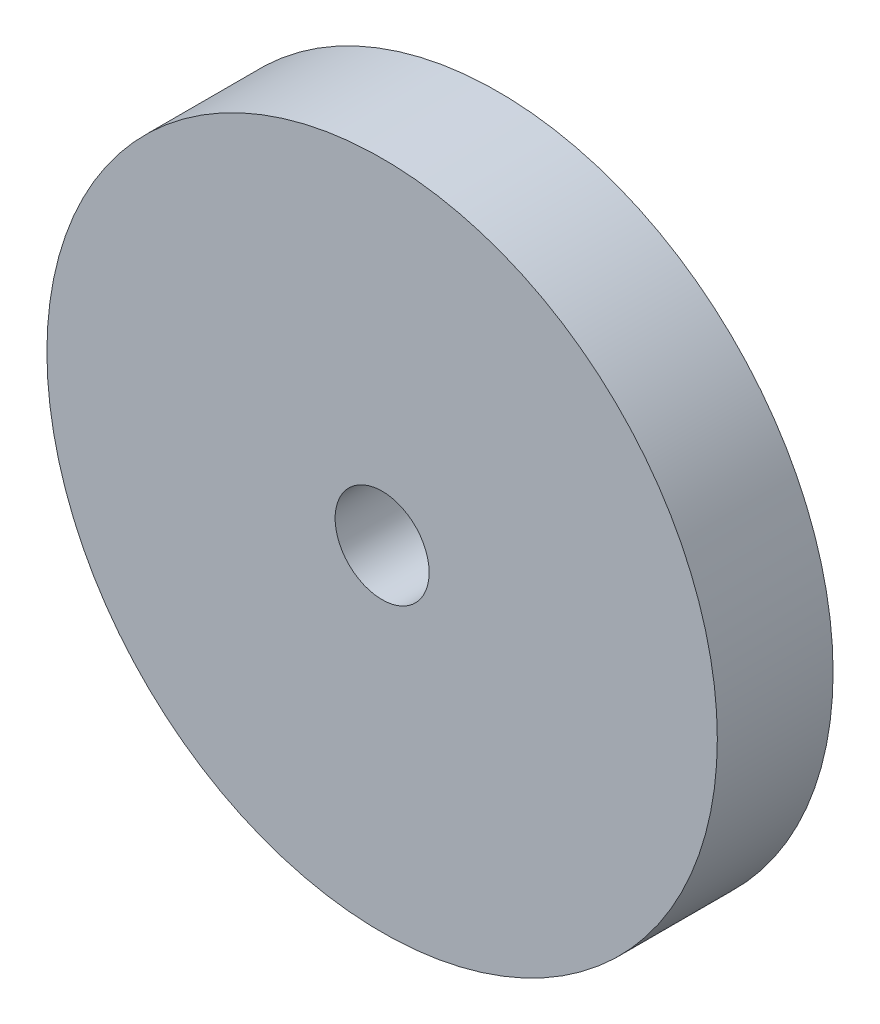
ISO-10303-21;
HEADER;
FILE_DESCRIPTION(('STEP AP214'),'2;1');
FILE_NAME('part.step','',(''),(''),'','','');
FILE_SCHEMA(('AUTOMOTIVE_DESIGN { 1 0 10303 214 1 1 1 1 }'));
ENDSEC;
DATA;
#1=APPLICATION_CONTEXT('core data for automotive mechanical design processes');
#2=APPLICATION_PROTOCOL_DEFINITION('international standard','automotive_design',2000,#1);
#3=PRODUCT_CONTEXT('',#1,'mechanical');
#4=PRODUCT('Part','Part','',(#3));
#5=PRODUCT_RELATED_PRODUCT_CATEGORY('part','',(#4));
#6=PRODUCT_DEFINITION_FORMATION('','',#4);
#7=PRODUCT_DEFINITION_CONTEXT('part definition',#1,'design');
#8=PRODUCT_DEFINITION('design','',#6,#7);
#9=PRODUCT_DEFINITION_SHAPE('','',#8);
#10=(LENGTH_UNIT() NAMED_UNIT(*) SI_UNIT(.MILLI.,.METRE.));
#11=(NAMED_UNIT(*) PLANE_ANGLE_UNIT() SI_UNIT($,.RADIAN.));
#12=(NAMED_UNIT(*) SI_UNIT($,.STERADIAN.) SOLID_ANGLE_UNIT());
#13=UNCERTAINTY_MEASURE_WITH_UNIT(LENGTH_MEASURE(1.E-05),#10,'distance_accuracy_value','');
#14=(GEOMETRIC_REPRESENTATION_CONTEXT(3) GLOBAL_UNCERTAINTY_ASSIGNED_CONTEXT((#13)) GLOBAL_UNIT_ASSIGNED_CONTEXT((#10,
#11,#12)) REPRESENTATION_CONTEXT('',''));
#15=CARTESIAN_POINT('',(0.,0.,0.));
#16=DIRECTION('',(0.,0.,1.));
#17=DIRECTION('',(1.,0.,0.));
#18=AXIS2_PLACEMENT_3D('',#15,#16,#17);
#19=CARTESIAN_POINT('',(0.,0.,6.));
#20=DIRECTION('',(0.,0.,1.));
#21=DIRECTION('',(1.,0.,0.));
#22=AXIS2_PLACEMENT_3D('',#19,#20,#21);
#23=PLANE('',#22);
#24=CARTESIAN_POINT('',(0.,0.,6.));
#25=DIRECTION('',(0.,0.,1.));
#26=DIRECTION('',(1.,0.,0.));
#27=AXIS2_PLACEMENT_3D('',#24,#25,#26);
#28=CIRCLE('',#27,17.3736);
#29=CARTESIAN_POINT('',(17.3736,0.,6.));
#30=VERTEX_POINT('',#29);
#31=EDGE_CURVE('E10',#30,#30,#28,.T.);
#32=ORIENTED_EDGE('',*,*,#31,.T.);
#33=EDGE_LOOP('',(#32));
#34=FACE_BOUND('',#33,.T.);
#35=CARTESIAN_POINT('',(0.,0.,6.));
#36=DIRECTION('',(0.,0.,1.));
#37=DIRECTION('',(1.,0.,0.));
#38=AXIS2_PLACEMENT_3D('',#35,#36,#37);
#39=CIRCLE('',#38,2.4365);
#40=CARTESIAN_POINT('',(2.4365,0.,6.));
#41=VERTEX_POINT('',#40);
#42=EDGE_CURVE('E42',#41,#41,#39,.T.);
#43=ORIENTED_EDGE('',*,*,#42,.F.);
#44=EDGE_LOOP('',(#43));
#45=FACE_BOUND('',#44,.T.);
#46=ADVANCED_FACE('F31',(#34,#45),#23,.T.);
#47=CARTESIAN_POINT('',(0.,0.,0.));
#48=DIRECTION('',(0.,0.,1.));
#49=DIRECTION('',(1.,0.,0.));
#50=AXIS2_PLACEMENT_3D('',#47,#48,#49);
#51=PLANE('',#50);
#52=CARTESIAN_POINT('',(0.,0.,0.));
#53=DIRECTION('',(0.,0.,1.));
#54=DIRECTION('',(1.,0.,0.));
#55=AXIS2_PLACEMENT_3D('',#52,#53,#54);
#56=CIRCLE('',#55,17.3736);
#57=CARTESIAN_POINT('',(17.3736,0.,0.));
#58=VERTEX_POINT('',#57);
#59=EDGE_CURVE('E35',#58,#58,#56,.T.);
#60=ORIENTED_EDGE('',*,*,#59,.F.);
#61=EDGE_LOOP('',(#60));
#62=FACE_BOUND('',#61,.T.);
#63=CARTESIAN_POINT('',(0.,0.,0.));
#64=DIRECTION('',(0.,0.,1.));
#65=DIRECTION('',(1.,0.,0.));
#66=AXIS2_PLACEMENT_3D('',#63,#64,#65);
#67=CIRCLE('',#66,2.4365);
#68=CARTESIAN_POINT('',(2.4365,0.,0.));
#69=VERTEX_POINT('',#68);
#70=EDGE_CURVE('E44',#69,#69,#67,.T.);
#71=ORIENTED_EDGE('',*,*,#70,.T.);
#72=EDGE_LOOP('',(#71));
#73=FACE_BOUND('',#72,.T.);
#74=ADVANCED_FACE('F54',(#62,#73),#51,.F.);
#75=CARTESIAN_POINT('',(0.,0.,6.));
#76=DIRECTION('',(0.,0.,-1.));
#77=DIRECTION('',(-1.,0.,0.));
#78=AXIS2_PLACEMENT_3D('',#75,#76,#77);
#79=CYLINDRICAL_SURFACE('',#78,17.3736);
#80=ORIENTED_EDGE('',*,*,#31,.F.);
#81=EDGE_LOOP('',(#80));
#82=FACE_BOUND('',#81,.T.);
#83=ORIENTED_EDGE('',*,*,#59,.T.);
#84=EDGE_LOOP('',(#83));
#85=FACE_BOUND('',#84,.T.);
#86=ADVANCED_FACE('F33',(#82,#85),#79,.T.);
#87=CARTESIAN_POINT('',(0.,0.,6.));
#88=DIRECTION('',(0.,0.,-1.));
#89=DIRECTION('',(-1.,0.,0.));
#90=AXIS2_PLACEMENT_3D('',#87,#88,#89);
#91=CYLINDRICAL_SURFACE('',#90,2.4365);
#92=ORIENTED_EDGE('',*,*,#42,.T.);
#93=EDGE_LOOP('',(#92));
#94=FACE_BOUND('',#93,.T.);
#95=ORIENTED_EDGE('',*,*,#70,.F.);
#96=EDGE_LOOP('',(#95));
#97=FACE_BOUND('',#96,.T.);
#98=ADVANCED_FACE('F50',(#94,#97),#91,.F.);
#99=CLOSED_SHELL('',(#46,#74,#86,#98));
#100=MANIFOLD_SOLID_BREP('B2',#99);
#101=ADVANCED_BREP_SHAPE_REPRESENTATION('',(#18,#100),#14);
#102=SHAPE_DEFINITION_REPRESENTATION(#9,#101);
ENDSEC;
END-ISO-10303-21;
